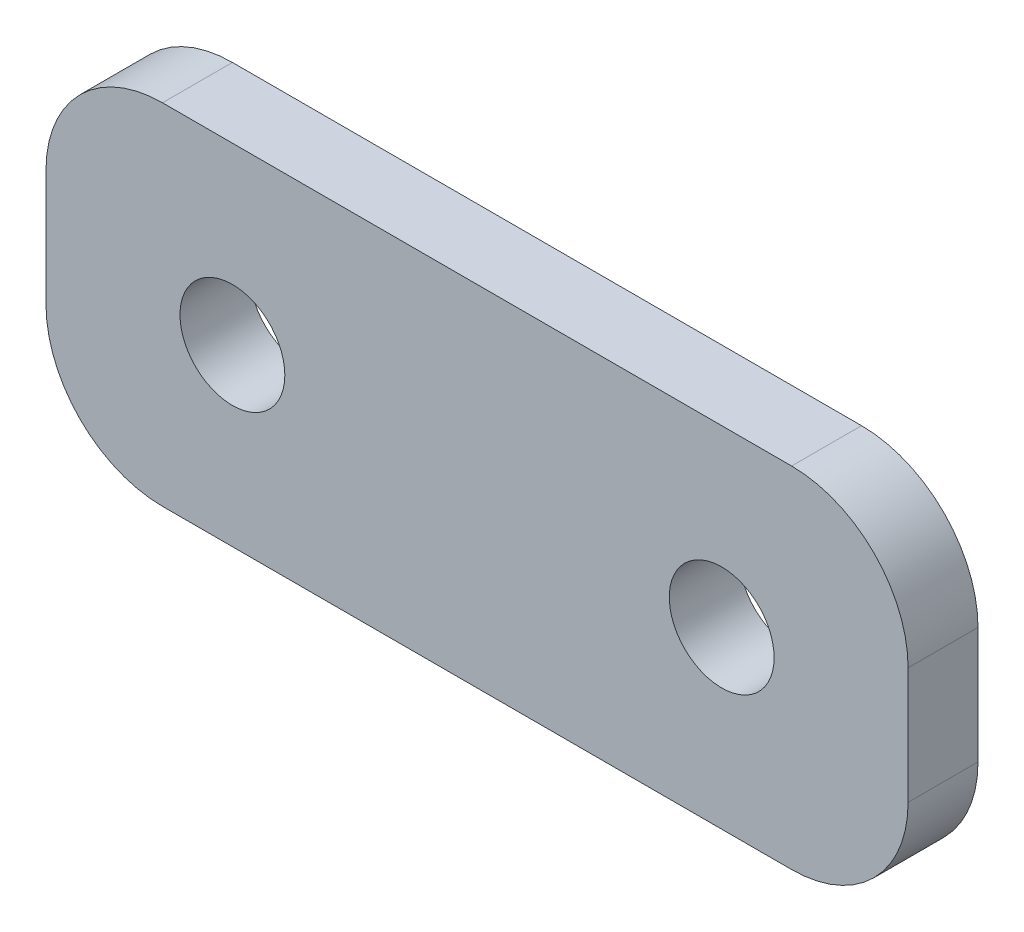
ISO-10303-21;
HEADER;
FILE_DESCRIPTION(('STEP AP214'),'2;1');
FILE_NAME('part.step','',(''),(''),'','','');
FILE_SCHEMA(('AUTOMOTIVE_DESIGN { 1 0 10303 214 1 1 1 1 }'));
ENDSEC;
DATA;
#1=APPLICATION_CONTEXT('core data for automotive mechanical design processes');
#2=APPLICATION_PROTOCOL_DEFINITION('international standard','automotive_design',2000,#1);
#3=PRODUCT_CONTEXT('',#1,'mechanical');
#4=PRODUCT('Part','Part','',(#3));
#5=PRODUCT_RELATED_PRODUCT_CATEGORY('part','',(#4));
#6=PRODUCT_DEFINITION_FORMATION('','',#4);
#7=PRODUCT_DEFINITION_CONTEXT('part definition',#1,'design');
#8=PRODUCT_DEFINITION('design','',#6,#7);
#9=PRODUCT_DEFINITION_SHAPE('','',#8);
#10=(LENGTH_UNIT() NAMED_UNIT(*) SI_UNIT(.MILLI.,.METRE.));
#11=(NAMED_UNIT(*) PLANE_ANGLE_UNIT() SI_UNIT($,.RADIAN.));
#12=(NAMED_UNIT(*) SI_UNIT($,.STERADIAN.) SOLID_ANGLE_UNIT());
#13=UNCERTAINTY_MEASURE_WITH_UNIT(LENGTH_MEASURE(1.E-05),#10,'distance_accuracy_value','');
#14=(GEOMETRIC_REPRESENTATION_CONTEXT(3) GLOBAL_UNCERTAINTY_ASSIGNED_CONTEXT((#13)) GLOBAL_UNIT_ASSIGNED_CONTEXT((#10,
#11,#12)) REPRESENTATION_CONTEXT('',''));
#15=CARTESIAN_POINT('',(0.,0.,0.));
#16=DIRECTION('',(0.,0.,1.));
#17=DIRECTION('',(1.,0.,0.));
#18=AXIS2_PLACEMENT_3D('',#15,#16,#17);
#19=CARTESIAN_POINT('',(13.5,2.5,3.));
#20=DIRECTION('',(0.,0.,-1.));
#21=DIRECTION('',(-1.,0.,0.));
#22=AXIS2_PLACEMENT_3D('',#19,#20,#21);
#23=PLANE('',#22);
#24=CARTESIAN_POINT('',(13.5,2.5,3.));
#25=DIRECTION('',(0.,0.,1.));
#26=DIRECTION('',(-1.,0.,0.));
#27=AXIS2_PLACEMENT_3D('',#24,#25,#26);
#28=CIRCLE('',#27,5.);
#29=CARTESIAN_POINT('',(18.5,2.49999999999996,3.));
#30=VERTEX_POINT('',#29);
#31=CARTESIAN_POINT('',(13.5,7.5,3.));
#32=VERTEX_POINT('',#31);
#33=EDGE_CURVE('E151',#30,#32,#28,.T.);
#34=ORIENTED_EDGE('',*,*,#33,.T.);
#35=DIRECTION('',(-1.,0.,0.));
#36=VECTOR('',#35,1.);
#37=CARTESIAN_POINT('',(-13.5,7.5,3.));
#38=LINE('',#37,#36);
#39=CARTESIAN_POINT('',(-13.5,7.5,3.));
#40=VERTEX_POINT('',#39);
#41=EDGE_CURVE('E99',#32,#40,#38,.T.);
#42=ORIENTED_EDGE('',*,*,#41,.T.);
#43=CARTESIAN_POINT('',(-13.5,2.5,3.));
#44=DIRECTION('',(0.,0.,1.));
#45=DIRECTION('',(-1.,0.,0.));
#46=AXIS2_PLACEMENT_3D('',#43,#44,#45);
#47=CIRCLE('',#46,5.);
#48=CARTESIAN_POINT('',(-18.5,2.49999999999996,3.));
#49=VERTEX_POINT('',#48);
#50=EDGE_CURVE('E166',#40,#49,#47,.T.);
#51=ORIENTED_EDGE('',*,*,#50,.T.);
#52=DIRECTION('',(0.,-1.,0.));
#53=VECTOR('',#52,1.);
#54=CARTESIAN_POINT('',(-18.5,-2.49999999999997,3.));
#55=LINE('',#54,#53);
#56=CARTESIAN_POINT('',(-18.5,-2.49999999999997,3.));
#57=VERTEX_POINT('',#56);
#58=EDGE_CURVE('E179',#49,#57,#55,.T.);
#59=ORIENTED_EDGE('',*,*,#58,.T.);
#60=CARTESIAN_POINT('',(-13.5,-2.5,3.));
#61=DIRECTION('',(0.,0.,1.));
#62=DIRECTION('',(-1.,0.,0.));
#63=AXIS2_PLACEMENT_3D('',#60,#61,#62);
#64=CIRCLE('',#63,5.);
#65=CARTESIAN_POINT('',(-13.5,-7.5,3.));
#66=VERTEX_POINT('',#65);
#67=EDGE_CURVE('E118',#57,#66,#64,.T.);
#68=ORIENTED_EDGE('',*,*,#67,.T.);
#69=DIRECTION('',(1.,0.,0.));
#70=VECTOR('',#69,1.);
#71=CARTESIAN_POINT('',(-13.5,-7.5,3.));
#72=LINE('',#71,#70);
#73=CARTESIAN_POINT('',(13.5,-7.5,3.));
#74=VERTEX_POINT('',#73);
#75=EDGE_CURVE('E112',#66,#74,#72,.T.);
#76=ORIENTED_EDGE('',*,*,#75,.T.);
#77=CARTESIAN_POINT('',(13.5,-2.5,3.));
#78=DIRECTION('',(0.,0.,1.));
#79=DIRECTION('',(1.,0.,0.));
#80=AXIS2_PLACEMENT_3D('',#77,#78,#79);
#81=CIRCLE('',#80,5.);
#82=CARTESIAN_POINT('',(18.5,-2.5,3.));
#83=VERTEX_POINT('',#82);
#84=EDGE_CURVE('E116',#74,#83,#81,.T.);
#85=ORIENTED_EDGE('',*,*,#84,.T.);
#86=DIRECTION('',(0.,1.,0.));
#87=VECTOR('',#86,1.);
#88=CARTESIAN_POINT('',(18.5,-2.49999999999997,3.));
#89=LINE('',#88,#87);
#90=EDGE_CURVE('E56',#83,#30,#89,.T.);
#91=ORIENTED_EDGE('',*,*,#90,.T.);
#92=EDGE_LOOP('',(#34,#42,#51,#59,#68,#76,#85,#91));
#93=FACE_BOUND('',#92,.T.);
#94=CARTESIAN_POINT('',(-10.5,0.,3.));
#95=DIRECTION('',(0.,0.,1.));
#96=DIRECTION('',(1.,0.,0.));
#97=AXIS2_PLACEMENT_3D('',#94,#95,#96);
#98=CIRCLE('',#97,2.25);
#99=CARTESIAN_POINT('',(-8.25,0.,3.));
#100=VERTEX_POINT('',#99);
#101=EDGE_CURVE('E140',#100,#100,#98,.T.);
#102=ORIENTED_EDGE('',*,*,#101,.F.);
#103=EDGE_LOOP('',(#102));
#104=FACE_BOUND('',#103,.T.);
#105=CARTESIAN_POINT('',(10.5,0.,3.));
#106=DIRECTION('',(0.,0.,1.));
#107=DIRECTION('',(1.,0.,0.));
#108=AXIS2_PLACEMENT_3D('',#105,#106,#107);
#109=CIRCLE('',#108,2.25);
#110=CARTESIAN_POINT('',(12.75,0.,3.));
#111=VERTEX_POINT('',#110);
#112=EDGE_CURVE('E188',#111,#111,#109,.T.);
#113=ORIENTED_EDGE('',*,*,#112,.F.);
#114=EDGE_LOOP('',(#113));
#115=FACE_BOUND('',#114,.T.);
#116=ADVANCED_FACE('F39',(#93,#104,#115),#23,.F.);
#117=CARTESIAN_POINT('',(13.5,2.5,0.));
#118=DIRECTION('',(0.,0.,-1.));
#119=DIRECTION('',(-1.,0.,0.));
#120=AXIS2_PLACEMENT_3D('',#117,#118,#119);
#121=PLANE('',#120);
#122=CARTESIAN_POINT('',(-10.5,0.,0.));
#123=DIRECTION('',(0.,0.,1.));
#124=DIRECTION('',(1.,0.,0.));
#125=AXIS2_PLACEMENT_3D('',#122,#123,#124);
#126=CIRCLE('',#125,2.25);
#127=CARTESIAN_POINT('',(-8.25,0.,0.));
#128=VERTEX_POINT('',#127);
#129=EDGE_CURVE('E185',#128,#128,#126,.T.);
#130=ORIENTED_EDGE('',*,*,#129,.T.);
#131=EDGE_LOOP('',(#130));
#132=FACE_BOUND('',#131,.T.);
#133=CARTESIAN_POINT('',(13.5,2.5,0.));
#134=DIRECTION('',(0.,0.,1.));
#135=DIRECTION('',(-1.,0.,0.));
#136=AXIS2_PLACEMENT_3D('',#133,#134,#135);
#137=CIRCLE('',#136,5.);
#138=CARTESIAN_POINT('',(18.5,2.49999999999996,0.));
#139=VERTEX_POINT('',#138);
#140=CARTESIAN_POINT('',(13.5,7.5,0.));
#141=VERTEX_POINT('',#140);
#142=EDGE_CURVE('E136',#139,#141,#137,.T.);
#143=ORIENTED_EDGE('',*,*,#142,.F.);
#144=DIRECTION('',(0.,1.,0.));
#145=VECTOR('',#144,1.);
#146=CARTESIAN_POINT('',(18.5,-2.49999999999997,0.));
#147=LINE('',#146,#145);
#148=CARTESIAN_POINT('',(18.5,-2.5,0.));
#149=VERTEX_POINT('',#148);
#150=EDGE_CURVE('E91',#149,#139,#147,.T.);
#151=ORIENTED_EDGE('',*,*,#150,.F.);
#152=CARTESIAN_POINT('',(13.5,-2.5,0.));
#153=DIRECTION('',(0.,0.,1.));
#154=DIRECTION('',(1.,0.,0.));
#155=AXIS2_PLACEMENT_3D('',#152,#153,#154);
#156=CIRCLE('',#155,5.);
#157=CARTESIAN_POINT('',(13.5,-7.5,0.));
#158=VERTEX_POINT('',#157);
#159=EDGE_CURVE('E85',#158,#149,#156,.T.);
#160=ORIENTED_EDGE('',*,*,#159,.F.);
#161=DIRECTION('',(1.,0.,0.));
#162=VECTOR('',#161,1.);
#163=CARTESIAN_POINT('',(-13.5,-7.5,0.));
#164=LINE('',#163,#162);
#165=CARTESIAN_POINT('',(-13.5,-7.5,0.));
#166=VERTEX_POINT('',#165);
#167=EDGE_CURVE('E126',#166,#158,#164,.T.);
#168=ORIENTED_EDGE('',*,*,#167,.F.);
#169=CARTESIAN_POINT('',(-13.5,-2.5,0.));
#170=DIRECTION('',(0.,0.,1.));
#171=DIRECTION('',(-1.,0.,0.));
#172=AXIS2_PLACEMENT_3D('',#169,#170,#171);
#173=CIRCLE('',#172,5.);
#174=CARTESIAN_POINT('',(-18.5,-2.49999999999997,0.));
#175=VERTEX_POINT('',#174);
#176=EDGE_CURVE('E146',#175,#166,#173,.T.);
#177=ORIENTED_EDGE('',*,*,#176,.F.);
#178=DIRECTION('',(0.,-1.,0.));
#179=VECTOR('',#178,1.);
#180=CARTESIAN_POINT('',(-18.5,-2.49999999999997,0.));
#181=LINE('',#180,#179);
#182=CARTESIAN_POINT('',(-18.5,2.49999999999996,0.));
#183=VERTEX_POINT('',#182);
#184=EDGE_CURVE('E144',#183,#175,#181,.T.);
#185=ORIENTED_EDGE('',*,*,#184,.F.);
#186=CARTESIAN_POINT('',(-13.5,2.5,0.));
#187=DIRECTION('',(0.,0.,1.));
#188=DIRECTION('',(-1.,0.,0.));
#189=AXIS2_PLACEMENT_3D('',#186,#187,#188);
#190=CIRCLE('',#189,5.);
#191=CARTESIAN_POINT('',(-13.5,7.5,0.));
#192=VERTEX_POINT('',#191);
#193=EDGE_CURVE('E142',#192,#183,#190,.T.);
#194=ORIENTED_EDGE('',*,*,#193,.F.);
#195=DIRECTION('',(-1.,0.,0.));
#196=VECTOR('',#195,1.);
#197=CARTESIAN_POINT('',(-13.5,7.5,0.));
#198=LINE('',#197,#196);
#199=EDGE_CURVE('E139',#141,#192,#198,.T.);
#200=ORIENTED_EDGE('',*,*,#199,.F.);
#201=EDGE_LOOP('',(#143,#151,#160,#168,#177,#185,#194,#200));
#202=FACE_BOUND('',#201,.T.);
#203=CARTESIAN_POINT('',(10.5,0.,0.));
#204=DIRECTION('',(0.,0.,1.));
#205=DIRECTION('',(1.,0.,0.));
#206=AXIS2_PLACEMENT_3D('',#203,#204,#205);
#207=CIRCLE('',#206,2.25);
#208=CARTESIAN_POINT('',(12.75,0.,0.));
#209=VERTEX_POINT('',#208);
#210=EDGE_CURVE('E191',#209,#209,#207,.T.);
#211=ORIENTED_EDGE('',*,*,#210,.T.);
#212=EDGE_LOOP('',(#211));
#213=FACE_BOUND('',#212,.T.);
#214=ADVANCED_FACE('F170',(#132,#202,#213),#121,.T.);
#215=CARTESIAN_POINT('',(13.5,2.5,3.));
#216=DIRECTION('',(0.,0.,-1.));
#217=DIRECTION('',(-1.,0.,0.));
#218=AXIS2_PLACEMENT_3D('',#215,#216,#217);
#219=CYLINDRICAL_SURFACE('',#218,5.);
#220=ORIENTED_EDGE('',*,*,#142,.T.);
#221=DIRECTION('',(0.,0.,-1.));
#222=VECTOR('',#221,1.);
#223=CARTESIAN_POINT('',(13.5,7.5,3.));
#224=LINE('',#223,#222);
#225=EDGE_CURVE('E11',#32,#141,#224,.T.);
#226=ORIENTED_EDGE('',*,*,#225,.F.);
#227=ORIENTED_EDGE('',*,*,#33,.F.);
#228=DIRECTION('',(0.,0.,-1.));
#229=VECTOR('',#228,1.);
#230=CARTESIAN_POINT('',(18.5,2.49999999999996,3.));
#231=LINE('',#230,#229);
#232=EDGE_CURVE('E132',#30,#139,#231,.T.);
#233=ORIENTED_EDGE('',*,*,#232,.T.);
#234=EDGE_LOOP('',(#220,#226,#227,#233));
#235=FACE_BOUND('',#234,.T.);
#236=ADVANCED_FACE('F41',(#235),#219,.T.);
#237=CARTESIAN_POINT('',(-13.5,7.5,3.));
#238=DIRECTION('',(0.,-1.,0.));
#239=DIRECTION('',(0.,0.,-1.));
#240=AXIS2_PLACEMENT_3D('',#237,#238,#239);
#241=PLANE('',#240);
#242=ORIENTED_EDGE('',*,*,#199,.T.);
#243=DIRECTION('',(0.,0.,-1.));
#244=VECTOR('',#243,1.);
#245=CARTESIAN_POINT('',(-13.5,7.5,3.));
#246=LINE('',#245,#244);
#247=EDGE_CURVE('E48',#40,#192,#246,.T.);
#248=ORIENTED_EDGE('',*,*,#247,.F.);
#249=ORIENTED_EDGE('',*,*,#41,.F.);
#250=ORIENTED_EDGE('',*,*,#225,.T.);
#251=EDGE_LOOP('',(#242,#248,#249,#250));
#252=FACE_BOUND('',#251,.T.);
#253=ADVANCED_FACE('F223',(#252),#241,.F.);
#254=CARTESIAN_POINT('',(-13.5,2.5,3.));
#255=DIRECTION('',(0.,0.,-1.));
#256=DIRECTION('',(-1.,0.,0.));
#257=AXIS2_PLACEMENT_3D('',#254,#255,#256);
#258=CYLINDRICAL_SURFACE('',#257,5.);
#259=ORIENTED_EDGE('',*,*,#193,.T.);
#260=DIRECTION('',(0.,0.,-1.));
#261=VECTOR('',#260,1.);
#262=CARTESIAN_POINT('',(-18.5,2.49999999999996,3.));
#263=LINE('',#262,#261);
#264=EDGE_CURVE('E158',#49,#183,#263,.T.);
#265=ORIENTED_EDGE('',*,*,#264,.F.);
#266=ORIENTED_EDGE('',*,*,#50,.F.);
#267=ORIENTED_EDGE('',*,*,#247,.T.);
#268=EDGE_LOOP('',(#259,#265,#266,#267));
#269=FACE_BOUND('',#268,.T.);
#270=ADVANCED_FACE('F164',(#269),#258,.T.);
#271=CARTESIAN_POINT('',(-18.5,-2.49999999999997,3.));
#272=DIRECTION('',(1.,0.,0.));
#273=DIRECTION('',(0.,0.,-1.));
#274=AXIS2_PLACEMENT_3D('',#271,#272,#273);
#275=PLANE('',#274);
#276=ORIENTED_EDGE('',*,*,#184,.T.);
#277=DIRECTION('',(0.,0.,-1.));
#278=VECTOR('',#277,1.);
#279=CARTESIAN_POINT('',(-18.5,-2.49999999999997,3.));
#280=LINE('',#279,#278);
#281=EDGE_CURVE('E155',#57,#175,#280,.T.);
#282=ORIENTED_EDGE('',*,*,#281,.F.);
#283=ORIENTED_EDGE('',*,*,#58,.F.);
#284=ORIENTED_EDGE('',*,*,#264,.T.);
#285=EDGE_LOOP('',(#276,#282,#283,#284));
#286=FACE_BOUND('',#285,.T.);
#287=ADVANCED_FACE('F175',(#286),#275,.F.);
#288=CARTESIAN_POINT('',(-13.5,-2.5,3.));
#289=DIRECTION('',(0.,0.,-1.));
#290=DIRECTION('',(-1.,0.,0.));
#291=AXIS2_PLACEMENT_3D('',#288,#289,#290);
#292=CYLINDRICAL_SURFACE('',#291,5.);
#293=ORIENTED_EDGE('',*,*,#176,.T.);
#294=DIRECTION('',(0.,0.,-1.));
#295=VECTOR('',#294,1.);
#296=CARTESIAN_POINT('',(-13.5,-7.5,3.));
#297=LINE('',#296,#295);
#298=EDGE_CURVE('E127',#66,#166,#297,.T.);
#299=ORIENTED_EDGE('',*,*,#298,.F.);
#300=ORIENTED_EDGE('',*,*,#67,.F.);
#301=ORIENTED_EDGE('',*,*,#281,.T.);
#302=EDGE_LOOP('',(#293,#299,#300,#301));
#303=FACE_BOUND('',#302,.T.);
#304=ADVANCED_FACE('F178',(#303),#292,.T.);
#305=CARTESIAN_POINT('',(-13.5,-7.5,3.));
#306=DIRECTION('',(0.,1.,0.));
#307=DIRECTION('',(-1.,0.,0.));
#308=AXIS2_PLACEMENT_3D('',#305,#306,#307);
#309=PLANE('',#308);
#310=ORIENTED_EDGE('',*,*,#167,.T.);
#311=DIRECTION('',(0.,0.,-1.));
#312=VECTOR('',#311,1.);
#313=CARTESIAN_POINT('',(13.5,-7.5,3.));
#314=LINE('',#313,#312);
#315=EDGE_CURVE('E123',#74,#158,#314,.T.);
#316=ORIENTED_EDGE('',*,*,#315,.F.);
#317=ORIENTED_EDGE('',*,*,#75,.F.);
#318=ORIENTED_EDGE('',*,*,#298,.T.);
#319=EDGE_LOOP('',(#310,#316,#317,#318));
#320=FACE_BOUND('',#319,.T.);
#321=ADVANCED_FACE('F124',(#320),#309,.F.);
#322=CARTESIAN_POINT('',(13.5,-2.5,3.));
#323=DIRECTION('',(0.,0.,-1.));
#324=DIRECTION('',(-1.,0.,0.));
#325=AXIS2_PLACEMENT_3D('',#322,#323,#324);
#326=CYLINDRICAL_SURFACE('',#325,5.);
#327=ORIENTED_EDGE('',*,*,#159,.T.);
#328=DIRECTION('',(0.,0.,-1.));
#329=VECTOR('',#328,1.);
#330=CARTESIAN_POINT('',(18.5,-2.5,3.));
#331=LINE('',#330,#329);
#332=EDGE_CURVE('E128',#83,#149,#331,.T.);
#333=ORIENTED_EDGE('',*,*,#332,.F.);
#334=ORIENTED_EDGE('',*,*,#84,.F.);
#335=ORIENTED_EDGE('',*,*,#315,.T.);
#336=EDGE_LOOP('',(#327,#333,#334,#335));
#337=FACE_BOUND('',#336,.T.);
#338=ADVANCED_FACE('F130',(#337),#326,.T.);
#339=CARTESIAN_POINT('',(18.5,-2.49999999999997,3.));
#340=DIRECTION('',(-1.,0.,0.));
#341=DIRECTION('',(0.,0.,1.));
#342=AXIS2_PLACEMENT_3D('',#339,#340,#341);
#343=PLANE('',#342);
#344=ORIENTED_EDGE('',*,*,#150,.T.);
#345=ORIENTED_EDGE('',*,*,#232,.F.);
#346=ORIENTED_EDGE('',*,*,#90,.F.);
#347=ORIENTED_EDGE('',*,*,#332,.T.);
#348=EDGE_LOOP('',(#344,#345,#346,#347));
#349=FACE_BOUND('',#348,.T.);
#350=ADVANCED_FACE('F211',(#349),#343,.F.);
#351=CARTESIAN_POINT('',(-10.5,0.,3.));
#352=DIRECTION('',(0.,0.,-1.));
#353=DIRECTION('',(-1.,0.,0.));
#354=AXIS2_PLACEMENT_3D('',#351,#352,#353);
#355=CYLINDRICAL_SURFACE('',#354,2.25);
#356=ORIENTED_EDGE('',*,*,#101,.T.);
#357=EDGE_LOOP('',(#356));
#358=FACE_BOUND('',#357,.T.);
#359=ORIENTED_EDGE('',*,*,#129,.F.);
#360=EDGE_LOOP('',(#359));
#361=FACE_BOUND('',#360,.T.);
#362=ADVANCED_FACE('F208',(#358,#361),#355,.F.);
#363=CARTESIAN_POINT('',(10.5,0.,3.));
#364=DIRECTION('',(0.,0.,-1.));
#365=DIRECTION('',(-1.,0.,0.));
#366=AXIS2_PLACEMENT_3D('',#363,#364,#365);
#367=CYLINDRICAL_SURFACE('',#366,2.25);
#368=ORIENTED_EDGE('',*,*,#112,.T.);
#369=EDGE_LOOP('',(#368));
#370=FACE_BOUND('',#369,.T.);
#371=ORIENTED_EDGE('',*,*,#210,.F.);
#372=EDGE_LOOP('',(#371));
#373=FACE_BOUND('',#372,.T.);
#374=ADVANCED_FACE('F197',(#370,#373),#367,.F.);
#375=CLOSED_SHELL('',(#116,#214,#236,#253,#270,#287,#304,#321,#338,#350,#362,#374));
#376=MANIFOLD_SOLID_BREP('B2',#375);
#377=ADVANCED_BREP_SHAPE_REPRESENTATION('',(#18,#376),#14);
#378=SHAPE_DEFINITION_REPRESENTATION(#9,#377);
ENDSEC;
END-ISO-10303-21;
